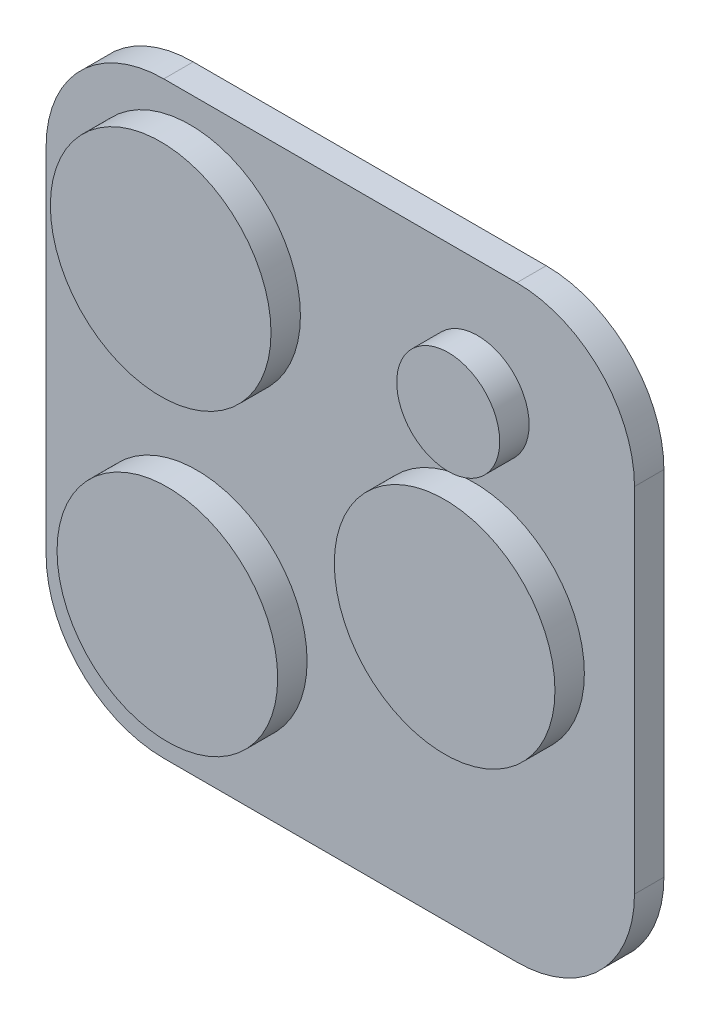
ISO-10303-21;
HEADER;
FILE_DESCRIPTION(('STEP AP214'),'2;1');
FILE_NAME('part.step','',(''),(''),'','','');
FILE_SCHEMA(('AUTOMOTIVE_DESIGN { 1 0 10303 214 1 1 1 1 }'));
ENDSEC;
DATA;
#1=APPLICATION_CONTEXT('core data for automotive mechanical design processes');
#2=APPLICATION_PROTOCOL_DEFINITION('international standard','automotive_design',2000,#1);
#3=PRODUCT_CONTEXT('',#1,'mechanical');
#4=PRODUCT('Part','Part','',(#3));
#5=PRODUCT_RELATED_PRODUCT_CATEGORY('part','',(#4));
#6=PRODUCT_DEFINITION_FORMATION('','',#4);
#7=PRODUCT_DEFINITION_CONTEXT('part definition',#1,'design');
#8=PRODUCT_DEFINITION('design','',#6,#7);
#9=PRODUCT_DEFINITION_SHAPE('','',#8);
#10=(LENGTH_UNIT() NAMED_UNIT(*) SI_UNIT(.MILLI.,.METRE.));
#11=(NAMED_UNIT(*) PLANE_ANGLE_UNIT() SI_UNIT($,.RADIAN.));
#12=(NAMED_UNIT(*) SI_UNIT($,.STERADIAN.) SOLID_ANGLE_UNIT());
#13=UNCERTAINTY_MEASURE_WITH_UNIT(LENGTH_MEASURE(1.E-05),#10,'distance_accuracy_value','');
#14=(GEOMETRIC_REPRESENTATION_CONTEXT(3) GLOBAL_UNCERTAINTY_ASSIGNED_CONTEXT((#13)) GLOBAL_UNIT_ASSIGNED_CONTEXT((#10,
#11,#12)) REPRESENTATION_CONTEXT('',''));
#15=CARTESIAN_POINT('',(0.,0.,0.));
#16=DIRECTION('',(0.,0.,1.));
#17=DIRECTION('',(1.,0.,0.));
#18=AXIS2_PLACEMENT_3D('',#15,#16,#17);
#19=CARTESIAN_POINT('',(-10.262996941896,-16.1590214067278,2.));
#20=DIRECTION('',(0.,0.,-1.));
#21=DIRECTION('',(-1.,0.,0.));
#22=AXIS2_PLACEMENT_3D('',#19,#20,#21);
#23=CYLINDRICAL_SURFACE('',#22,8.);
#24=CARTESIAN_POINT('',(-10.262996941896,-16.1590214067278,0.));
#25=DIRECTION('',(0.,0.,1.));
#26=DIRECTION('',(1.,0.,0.));
#27=AXIS2_PLACEMENT_3D('',#24,#25,#26);
#28=CIRCLE('',#27,8.);
#29=CARTESIAN_POINT('',(-10.2629969418961,-24.1590214067278,0.));
#30=VERTEX_POINT('',#29);
#31=CARTESIAN_POINT('',(-2.26299694189602,-16.1590214067278,0.));
#32=VERTEX_POINT('',#31);
#33=EDGE_CURVE('E135',#30,#32,#28,.T.);
#34=ORIENTED_EDGE('',*,*,#33,.T.);
#35=DIRECTION('',(0.,0.,-1.));
#36=VECTOR('',#35,1.);
#37=CARTESIAN_POINT('',(-2.26299694189602,-16.1590214067278,2.));
#38=LINE('',#37,#36);
#39=CARTESIAN_POINT('',(-2.26299694189602,-16.1590214067278,2.));
#40=VERTEX_POINT('',#39);
#41=EDGE_CURVE('E11',#40,#32,#38,.T.);
#42=ORIENTED_EDGE('',*,*,#41,.F.);
#43=CARTESIAN_POINT('',(-10.262996941896,-16.1590214067278,2.));
#44=DIRECTION('',(0.,0.,1.));
#45=DIRECTION('',(1.,0.,0.));
#46=AXIS2_PLACEMENT_3D('',#43,#44,#45);
#47=CIRCLE('',#46,8.);
#48=CARTESIAN_POINT('',(-10.2629969418961,-24.1590214067278,2.));
#49=VERTEX_POINT('',#48);
#50=EDGE_CURVE('E150',#49,#40,#47,.T.);
#51=ORIENTED_EDGE('',*,*,#50,.F.);
#52=DIRECTION('',(0.,0.,-1.));
#53=VECTOR('',#52,1.);
#54=CARTESIAN_POINT('',(-10.2629969418961,-24.1590214067278,2.));
#55=LINE('',#54,#53);
#56=EDGE_CURVE('E131',#49,#30,#55,.T.);
#57=ORIENTED_EDGE('',*,*,#56,.T.);
#58=EDGE_LOOP('',(#34,#42,#51,#57));
#59=FACE_BOUND('',#58,.T.);
#60=ADVANCED_FACE('F39',(#59),#23,.T.);
#61=CARTESIAN_POINT('',(-2.26299694189602,7.84097859327211,2.));
#62=DIRECTION('',(-1.,0.,0.));
#63=DIRECTION('',(0.,-1.,0.));
#64=AXIS2_PLACEMENT_3D('',#61,#62,#63);
#65=PLANE('',#64);
#66=DIRECTION('',(0.,1.,0.));
#67=VECTOR('',#66,1.);
#68=CARTESIAN_POINT('',(-2.26299694189602,7.84097859327211,0.));
#69=LINE('',#68,#67);
#70=CARTESIAN_POINT('',(-2.26299694189602,7.84097859327211,0.));
#71=VERTEX_POINT('',#70);
#72=EDGE_CURVE('E138',#32,#71,#69,.T.);
#73=ORIENTED_EDGE('',*,*,#72,.T.);
#74=DIRECTION('',(0.,0.,-1.));
#75=VECTOR('',#74,1.);
#76=CARTESIAN_POINT('',(-2.26299694189602,7.84097859327211,2.));
#77=LINE('',#76,#75);
#78=CARTESIAN_POINT('',(-2.26299694189602,7.84097859327211,2.));
#79=VERTEX_POINT('',#78);
#80=EDGE_CURVE('E47',#79,#71,#77,.T.);
#81=ORIENTED_EDGE('',*,*,#80,.F.);
#82=DIRECTION('',(0.,1.,0.));
#83=VECTOR('',#82,1.);
#84=CARTESIAN_POINT('',(-2.26299694189602,7.84097859327211,2.));
#85=LINE('',#84,#83);
#86=EDGE_CURVE('E98',#40,#79,#85,.T.);
#87=ORIENTED_EDGE('',*,*,#86,.F.);
#88=ORIENTED_EDGE('',*,*,#41,.T.);
#89=EDGE_LOOP('',(#73,#81,#87,#88));
#90=FACE_BOUND('',#89,.T.);
#91=ADVANCED_FACE('F234',(#90),#65,.F.);
#92=CARTESIAN_POINT('',(-10.262996941896,7.84097859327217,2.));
#93=DIRECTION('',(0.,0.,-1.));
#94=DIRECTION('',(-1.,0.,0.));
#95=AXIS2_PLACEMENT_3D('',#92,#93,#94);
#96=CYLINDRICAL_SURFACE('',#95,8.);
#97=CARTESIAN_POINT('',(-10.262996941896,7.84097859327217,0.));
#98=DIRECTION('',(0.,0.,1.));
#99=DIRECTION('',(-1.,0.,0.));
#100=AXIS2_PLACEMENT_3D('',#97,#98,#99);
#101=CIRCLE('',#100,8.);
#102=CARTESIAN_POINT('',(-10.2629969418961,15.8409785932722,0.));
#103=VERTEX_POINT('',#102);
#104=EDGE_CURVE('E141',#71,#103,#101,.T.);
#105=ORIENTED_EDGE('',*,*,#104,.T.);
#106=DIRECTION('',(0.,0.,-1.));
#107=VECTOR('',#106,1.);
#108=CARTESIAN_POINT('',(-10.2629969418961,15.8409785932722,2.));
#109=LINE('',#108,#107);
#110=CARTESIAN_POINT('',(-10.2629969418961,15.8409785932722,2.));
#111=VERTEX_POINT('',#110);
#112=EDGE_CURVE('E157',#111,#103,#109,.T.);
#113=ORIENTED_EDGE('',*,*,#112,.F.);
#114=CARTESIAN_POINT('',(-10.262996941896,7.84097859327217,2.));
#115=DIRECTION('',(0.,0.,1.));
#116=DIRECTION('',(-1.,0.,0.));
#117=AXIS2_PLACEMENT_3D('',#114,#115,#116);
#118=CIRCLE('',#117,8.);
#119=EDGE_CURVE('E165',#79,#111,#118,.T.);
#120=ORIENTED_EDGE('',*,*,#119,.F.);
#121=ORIENTED_EDGE('',*,*,#80,.T.);
#122=EDGE_LOOP('',(#105,#113,#120,#121));
#123=FACE_BOUND('',#122,.T.);
#124=ADVANCED_FACE('F163',(#123),#96,.T.);
#125=CARTESIAN_POINT('',(-34.262996941896,15.8409785932722,2.));
#126=DIRECTION('',(0.,-1.,0.));
#127=DIRECTION('',(0.,0.,-1.));
#128=AXIS2_PLACEMENT_3D('',#125,#126,#127);
#129=PLANE('',#128);
#130=DIRECTION('',(-1.,0.,0.));
#131=VECTOR('',#130,1.);
#132=CARTESIAN_POINT('',(-34.262996941896,15.8409785932722,0.));
#133=LINE('',#132,#131);
#134=CARTESIAN_POINT('',(-34.262996941896,15.8409785932722,0.));
#135=VERTEX_POINT('',#134);
#136=EDGE_CURVE('E143',#103,#135,#133,.T.);
#137=ORIENTED_EDGE('',*,*,#136,.T.);
#138=DIRECTION('',(0.,0.,-1.));
#139=VECTOR('',#138,1.);
#140=CARTESIAN_POINT('',(-34.262996941896,15.8409785932722,2.));
#141=LINE('',#140,#139);
#142=CARTESIAN_POINT('',(-34.262996941896,15.8409785932722,2.));
#143=VERTEX_POINT('',#142);
#144=EDGE_CURVE('E154',#143,#135,#141,.T.);
#145=ORIENTED_EDGE('',*,*,#144,.F.);
#146=DIRECTION('',(-1.,0.,0.));
#147=VECTOR('',#146,1.);
#148=CARTESIAN_POINT('',(-34.262996941896,15.8409785932722,2.));
#149=LINE('',#148,#147);
#150=EDGE_CURVE('E177',#111,#143,#149,.T.);
#151=ORIENTED_EDGE('',*,*,#150,.F.);
#152=ORIENTED_EDGE('',*,*,#112,.T.);
#153=EDGE_LOOP('',(#137,#145,#151,#152));
#154=FACE_BOUND('',#153,.T.);
#155=ADVANCED_FACE('F173',(#154),#129,.F.);
#156=CARTESIAN_POINT('',(-34.262996941896,7.84097859327217,2.));
#157=DIRECTION('',(0.,0.,-1.));
#158=DIRECTION('',(-1.,0.,0.));
#159=AXIS2_PLACEMENT_3D('',#156,#157,#158);
#160=CYLINDRICAL_SURFACE('',#159,8.);
#161=CARTESIAN_POINT('',(-34.262996941896,7.84097859327217,0.));
#162=DIRECTION('',(0.,0.,1.));
#163=DIRECTION('',(-1.,0.,0.));
#164=AXIS2_PLACEMENT_3D('',#161,#162,#163);
#165=CIRCLE('',#164,8.);
#166=CARTESIAN_POINT('',(-42.262996941896,7.84097859327211,0.));
#167=VERTEX_POINT('',#166);
#168=EDGE_CURVE('E145',#135,#167,#165,.T.);
#169=ORIENTED_EDGE('',*,*,#168,.T.);
#170=DIRECTION('',(0.,0.,-1.));
#171=VECTOR('',#170,1.);
#172=CARTESIAN_POINT('',(-42.262996941896,7.84097859327211,2.));
#173=LINE('',#172,#171);
#174=CARTESIAN_POINT('',(-42.262996941896,7.84097859327211,2.));
#175=VERTEX_POINT('',#174);
#176=EDGE_CURVE('E126',#175,#167,#173,.T.);
#177=ORIENTED_EDGE('',*,*,#176,.F.);
#178=CARTESIAN_POINT('',(-34.262996941896,7.84097859327217,2.));
#179=DIRECTION('',(0.,0.,1.));
#180=DIRECTION('',(-1.,0.,0.));
#181=AXIS2_PLACEMENT_3D('',#178,#179,#180);
#182=CIRCLE('',#181,8.);
#183=EDGE_CURVE('E117',#143,#175,#182,.T.);
#184=ORIENTED_EDGE('',*,*,#183,.F.);
#185=ORIENTED_EDGE('',*,*,#144,.T.);
#186=EDGE_LOOP('',(#169,#177,#184,#185));
#187=FACE_BOUND('',#186,.T.);
#188=ADVANCED_FACE('F176',(#187),#160,.T.);
#189=CARTESIAN_POINT('',(-42.262996941896,7.84097859327211,2.));
#190=DIRECTION('',(1.,0.,0.));
#191=DIRECTION('',(0.,0.,-1.));
#192=AXIS2_PLACEMENT_3D('',#189,#190,#191);
#193=PLANE('',#192);
#194=DIRECTION('',(0.,-1.,0.));
#195=VECTOR('',#194,1.);
#196=CARTESIAN_POINT('',(-42.262996941896,7.84097859327211,0.));
#197=LINE('',#196,#195);
#198=CARTESIAN_POINT('',(-42.262996941896,-16.1590214067278,0.));
#199=VERTEX_POINT('',#198);
#200=EDGE_CURVE('E125',#167,#199,#197,.T.);
#201=ORIENTED_EDGE('',*,*,#200,.T.);
#202=DIRECTION('',(0.,0.,-1.));
#203=VECTOR('',#202,1.);
#204=CARTESIAN_POINT('',(-42.262996941896,-16.1590214067278,2.));
#205=LINE('',#204,#203);
#206=CARTESIAN_POINT('',(-42.262996941896,-16.1590214067278,2.));
#207=VERTEX_POINT('',#206);
#208=EDGE_CURVE('E122',#207,#199,#205,.T.);
#209=ORIENTED_EDGE('',*,*,#208,.F.);
#210=DIRECTION('',(0.,-1.,0.));
#211=VECTOR('',#210,1.);
#212=CARTESIAN_POINT('',(-42.262996941896,7.84097859327211,2.));
#213=LINE('',#212,#211);
#214=EDGE_CURVE('E111',#175,#207,#213,.T.);
#215=ORIENTED_EDGE('',*,*,#214,.F.);
#216=ORIENTED_EDGE('',*,*,#176,.T.);
#217=EDGE_LOOP('',(#201,#209,#215,#216));
#218=FACE_BOUND('',#217,.T.);
#219=ADVANCED_FACE('F123',(#218),#193,.F.);
#220=CARTESIAN_POINT('',(-34.262996941896,-16.1590214067278,2.));
#221=DIRECTION('',(0.,0.,-1.));
#222=DIRECTION('',(-1.,0.,0.));
#223=AXIS2_PLACEMENT_3D('',#220,#221,#222);
#224=CYLINDRICAL_SURFACE('',#223,8.);
#225=CARTESIAN_POINT('',(-34.262996941896,-16.1590214067278,0.));
#226=DIRECTION('',(0.,0.,1.));
#227=DIRECTION('',(-1.,0.,0.));
#228=AXIS2_PLACEMENT_3D('',#225,#226,#227);
#229=CIRCLE('',#228,8.);
#230=CARTESIAN_POINT('',(-34.262996941896,-24.1590214067278,0.));
#231=VERTEX_POINT('',#230);
#232=EDGE_CURVE('E84',#199,#231,#229,.T.);
#233=ORIENTED_EDGE('',*,*,#232,.T.);
#234=DIRECTION('',(0.,0.,-1.));
#235=VECTOR('',#234,1.);
#236=CARTESIAN_POINT('',(-34.262996941896,-24.1590214067278,2.));
#237=LINE('',#236,#235);
#238=CARTESIAN_POINT('',(-34.262996941896,-24.1590214067278,2.));
#239=VERTEX_POINT('',#238);
#240=EDGE_CURVE('E127',#239,#231,#237,.T.);
#241=ORIENTED_EDGE('',*,*,#240,.F.);
#242=CARTESIAN_POINT('',(-34.262996941896,-16.1590214067278,2.));
#243=DIRECTION('',(0.,0.,1.));
#244=DIRECTION('',(-1.,0.,0.));
#245=AXIS2_PLACEMENT_3D('',#242,#243,#244);
#246=CIRCLE('',#245,8.);
#247=EDGE_CURVE('E115',#207,#239,#246,.T.);
#248=ORIENTED_EDGE('',*,*,#247,.F.);
#249=ORIENTED_EDGE('',*,*,#208,.T.);
#250=EDGE_LOOP('',(#233,#241,#248,#249));
#251=FACE_BOUND('',#250,.T.);
#252=ADVANCED_FACE('F129',(#251),#224,.T.);
#253=CARTESIAN_POINT('',(-34.262996941896,-24.1590214067278,2.));
#254=DIRECTION('',(0.,1.,0.));
#255=DIRECTION('',(0.,0.,1.));
#256=AXIS2_PLACEMENT_3D('',#253,#254,#255);
#257=PLANE('',#256);
#258=DIRECTION('',(1.,0.,0.));
#259=VECTOR('',#258,1.);
#260=CARTESIAN_POINT('',(-34.262996941896,-24.1590214067278,0.));
#261=LINE('',#260,#259);
#262=EDGE_CURVE('E90',#231,#30,#261,.T.);
#263=ORIENTED_EDGE('',*,*,#262,.T.);
#264=ORIENTED_EDGE('',*,*,#56,.F.);
#265=DIRECTION('',(1.,0.,0.));
#266=VECTOR('',#265,1.);
#267=CARTESIAN_POINT('',(-34.262996941896,-24.1590214067278,2.));
#268=LINE('',#267,#266);
#269=EDGE_CURVE('E55',#239,#49,#268,.T.);
#270=ORIENTED_EDGE('',*,*,#269,.F.);
#271=ORIENTED_EDGE('',*,*,#240,.T.);
#272=EDGE_LOOP('',(#263,#264,#270,#271));
#273=FACE_BOUND('',#272,.T.);
#274=ADVANCED_FACE('F211',(#273),#257,.F.);
#275=CARTESIAN_POINT('',(-10.262996941896,-16.1590214067278,2.));
#276=DIRECTION('',(0.,0.,1.));
#277=DIRECTION('',(1.,0.,0.));
#278=AXIS2_PLACEMENT_3D('',#275,#276,#277);
#279=PLANE('',#278);
#280=CARTESIAN_POINT('',(-12.9257864706033,7.90081492161476,2.));
#281=DIRECTION('',(0.,0.,1.));
#282=DIRECTION('',(1.,0.,0.));
#283=AXIS2_PLACEMENT_3D('',#280,#281,#282);
#284=CIRCLE('',#283,3.5);
#285=CARTESIAN_POINT('',(-9.42578647060328,7.90081492161476,2.));
#286=VERTEX_POINT('',#285);
#287=EDGE_CURVE('E198',#286,#286,#284,.T.);
#288=ORIENTED_EDGE('',*,*,#287,.F.);
#289=EDGE_LOOP('',(#288));
#290=FACE_BOUND('',#289,.T.);
#291=CARTESIAN_POINT('',(-13.1701246885437,-4.87458333069606,2.));
#292=DIRECTION('',(0.,0.,1.));
#293=DIRECTION('',(1.,0.,0.));
#294=AXIS2_PLACEMENT_3D('',#291,#292,#293);
#295=CIRCLE('',#294,7.5);
#296=CARTESIAN_POINT('',(-5.67012468854365,-4.87458333069606,2.));
#297=VERTEX_POINT('',#296);
#298=EDGE_CURVE('E192',#297,#297,#295,.T.);
#299=ORIENTED_EDGE('',*,*,#298,.F.);
#300=EDGE_LOOP('',(#299));
#301=FACE_BOUND('',#300,.T.);
#302=CARTESIAN_POINT('',(-32.019072929658,-13.5660427974321,2.));
#303=DIRECTION('',(0.,0.,1.));
#304=DIRECTION('',(1.,0.,0.));
#305=AXIS2_PLACEMENT_3D('',#302,#303,#304);
#306=CIRCLE('',#305,7.5);
#307=CARTESIAN_POINT('',(-24.519072929658,-13.5660427974321,2.));
#308=VERTEX_POINT('',#307);
#309=EDGE_CURVE('E186',#308,#308,#306,.T.);
#310=ORIENTED_EDGE('',*,*,#309,.F.);
#311=EDGE_LOOP('',(#310));
#312=FACE_BOUND('',#311,.T.);
#313=CARTESIAN_POINT('',(-32.4728439058329,6.53950199308984,2.));
#314=DIRECTION('',(0.,0.,1.));
#315=DIRECTION('',(1.,0.,0.));
#316=AXIS2_PLACEMENT_3D('',#313,#314,#315);
#317=CIRCLE('',#316,7.5);
#318=CARTESIAN_POINT('',(-24.9728439058329,6.53950199308984,2.));
#319=VERTEX_POINT('',#318);
#320=EDGE_CURVE('E183',#319,#319,#317,.T.);
#321=ORIENTED_EDGE('',*,*,#320,.F.);
#322=EDGE_LOOP('',(#321));
#323=FACE_BOUND('',#322,.T.);
#324=ORIENTED_EDGE('',*,*,#50,.T.);
#325=ORIENTED_EDGE('',*,*,#86,.T.);
#326=ORIENTED_EDGE('',*,*,#119,.T.);
#327=ORIENTED_EDGE('',*,*,#150,.T.);
#328=ORIENTED_EDGE('',*,*,#183,.T.);
#329=ORIENTED_EDGE('',*,*,#214,.T.);
#330=ORIENTED_EDGE('',*,*,#247,.T.);
#331=ORIENTED_EDGE('',*,*,#269,.T.);
#332=EDGE_LOOP('',(#324,#325,#326,#327,#328,#329,#330,#331));
#333=FACE_BOUND('',#332,.T.);
#334=ADVANCED_FACE('F113',(#290,#301,#312,#323,#333),#279,.T.);
#335=CARTESIAN_POINT('',(-10.262996941896,-16.1590214067278,0.));
#336=DIRECTION('',(0.,0.,1.));
#337=DIRECTION('',(1.,0.,0.));
#338=AXIS2_PLACEMENT_3D('',#335,#336,#337);
#339=PLANE('',#338);
#340=ORIENTED_EDGE('',*,*,#33,.F.);
#341=ORIENTED_EDGE('',*,*,#262,.F.);
#342=ORIENTED_EDGE('',*,*,#232,.F.);
#343=ORIENTED_EDGE('',*,*,#200,.F.);
#344=ORIENTED_EDGE('',*,*,#168,.F.);
#345=ORIENTED_EDGE('',*,*,#136,.F.);
#346=ORIENTED_EDGE('',*,*,#104,.F.);
#347=ORIENTED_EDGE('',*,*,#72,.F.);
#348=EDGE_LOOP('',(#340,#341,#342,#343,#344,#345,#346,#347));
#349=FACE_BOUND('',#348,.T.);
#350=ADVANCED_FACE('F169',(#349),#339,.F.);
#351=CARTESIAN_POINT('',(-32.4728439058329,6.53950199308984,4.));
#352=DIRECTION('',(0.,0.,-1.));
#353=DIRECTION('',(-1.,0.,0.));
#354=AXIS2_PLACEMENT_3D('',#351,#352,#353);
#355=CYLINDRICAL_SURFACE('',#354,7.5);
#356=CARTESIAN_POINT('',(-32.4728439058329,6.53950199308984,4.));
#357=DIRECTION('',(0.,0.,1.));
#358=DIRECTION('',(1.,0.,0.));
#359=AXIS2_PLACEMENT_3D('',#356,#357,#358);
#360=CIRCLE('',#359,7.5);
#361=CARTESIAN_POINT('',(-24.9728439058329,6.53950199308984,4.));
#362=VERTEX_POINT('',#361);
#363=EDGE_CURVE('E139',#362,#362,#360,.T.);
#364=ORIENTED_EDGE('',*,*,#363,.F.);
#365=EDGE_LOOP('',(#364));
#366=FACE_BOUND('',#365,.T.);
#367=ORIENTED_EDGE('',*,*,#320,.T.);
#368=EDGE_LOOP('',(#367));
#369=FACE_BOUND('',#368,.T.);
#370=ADVANCED_FACE('F219',(#366,#369),#355,.T.);
#371=CARTESIAN_POINT('',(-32.4728439058329,6.53950199308984,4.));
#372=DIRECTION('',(0.,0.,1.));
#373=DIRECTION('',(1.,0.,0.));
#374=AXIS2_PLACEMENT_3D('',#371,#372,#373);
#375=PLANE('',#374);
#376=ORIENTED_EDGE('',*,*,#363,.T.);
#377=EDGE_LOOP('',(#376));
#378=FACE_BOUND('',#377,.T.);
#379=ADVANCED_FACE('F221',(#378),#375,.T.);
#380=CARTESIAN_POINT('',(-32.019072929658,-13.5660427974321,4.));
#381=DIRECTION('',(0.,0.,-1.));
#382=DIRECTION('',(-1.,0.,0.));
#383=AXIS2_PLACEMENT_3D('',#380,#381,#382);
#384=CYLINDRICAL_SURFACE('',#383,7.5);
#385=CARTESIAN_POINT('',(-32.019072929658,-13.5660427974321,4.));
#386=DIRECTION('',(0.,0.,1.));
#387=DIRECTION('',(1.,0.,0.));
#388=AXIS2_PLACEMENT_3D('',#385,#386,#387);
#389=CIRCLE('',#388,7.5);
#390=CARTESIAN_POINT('',(-24.519072929658,-13.5660427974321,4.));
#391=VERTEX_POINT('',#390);
#392=EDGE_CURVE('E189',#391,#391,#389,.T.);
#393=ORIENTED_EDGE('',*,*,#392,.F.);
#394=EDGE_LOOP('',(#393));
#395=FACE_BOUND('',#394,.T.);
#396=ORIENTED_EDGE('',*,*,#309,.T.);
#397=EDGE_LOOP('',(#396));
#398=FACE_BOUND('',#397,.T.);
#399=ADVANCED_FACE('F228',(#395,#398),#384,.T.);
#400=CARTESIAN_POINT('',(-32.019072929658,-13.5660427974321,4.));
#401=DIRECTION('',(0.,0.,1.));
#402=DIRECTION('',(1.,0.,0.));
#403=AXIS2_PLACEMENT_3D('',#400,#401,#402);
#404=PLANE('',#403);
#405=ORIENTED_EDGE('',*,*,#392,.T.);
#406=EDGE_LOOP('',(#405));
#407=FACE_BOUND('',#406,.T.);
#408=ADVANCED_FACE('F316',(#407),#404,.T.);
#409=CARTESIAN_POINT('',(-13.1701246885437,-4.87458333069606,4.));
#410=DIRECTION('',(0.,0.,-1.));
#411=DIRECTION('',(-1.,0.,0.));
#412=AXIS2_PLACEMENT_3D('',#409,#410,#411);
#413=CYLINDRICAL_SURFACE('',#412,7.5);
#414=CARTESIAN_POINT('',(-13.1701246885437,-4.87458333069606,4.));
#415=DIRECTION('',(0.,0.,1.));
#416=DIRECTION('',(1.,0.,0.));
#417=AXIS2_PLACEMENT_3D('',#414,#415,#416);
#418=CIRCLE('',#417,7.5);
#419=CARTESIAN_POINT('',(-5.67012468854365,-4.87458333069606,4.));
#420=VERTEX_POINT('',#419);
#421=EDGE_CURVE('E195',#420,#420,#418,.T.);
#422=ORIENTED_EDGE('',*,*,#421,.F.);
#423=EDGE_LOOP('',(#422));
#424=FACE_BOUND('',#423,.T.);
#425=ORIENTED_EDGE('',*,*,#298,.T.);
#426=EDGE_LOOP('',(#425));
#427=FACE_BOUND('',#426,.T.);
#428=ADVANCED_FACE('F327',(#424,#427),#413,.T.);
#429=CARTESIAN_POINT('',(-13.1701246885437,-4.87458333069606,4.));
#430=DIRECTION('',(0.,0.,1.));
#431=DIRECTION('',(1.,0.,0.));
#432=AXIS2_PLACEMENT_3D('',#429,#430,#431);
#433=PLANE('',#432);
#434=ORIENTED_EDGE('',*,*,#421,.T.);
#435=EDGE_LOOP('',(#434));
#436=FACE_BOUND('',#435,.T.);
#437=ADVANCED_FACE('F338',(#436),#433,.T.);
#438=CARTESIAN_POINT('',(-12.9257864706033,7.90081492161476,4.));
#439=DIRECTION('',(0.,0.,-1.));
#440=DIRECTION('',(-1.,0.,0.));
#441=AXIS2_PLACEMENT_3D('',#438,#439,#440);
#442=CYLINDRICAL_SURFACE('',#441,3.5);
#443=CARTESIAN_POINT('',(-12.9257864706033,7.90081492161476,4.));
#444=DIRECTION('',(0.,0.,1.));
#445=DIRECTION('',(1.,0.,0.));
#446=AXIS2_PLACEMENT_3D('',#443,#444,#445);
#447=CIRCLE('',#446,3.5);
#448=CARTESIAN_POINT('',(-9.42578647060328,7.90081492161476,4.));
#449=VERTEX_POINT('',#448);
#450=EDGE_CURVE('E201',#449,#449,#447,.T.);
#451=ORIENTED_EDGE('',*,*,#450,.F.);
#452=EDGE_LOOP('',(#451));
#453=FACE_BOUND('',#452,.T.);
#454=ORIENTED_EDGE('',*,*,#287,.T.);
#455=EDGE_LOOP('',(#454));
#456=FACE_BOUND('',#455,.T.);
#457=ADVANCED_FACE('F207',(#453,#456),#442,.T.);
#458=CARTESIAN_POINT('',(-12.9257864706033,7.90081492161476,4.));
#459=DIRECTION('',(0.,0.,1.));
#460=DIRECTION('',(1.,0.,0.));
#461=AXIS2_PLACEMENT_3D('',#458,#459,#460);
#462=PLANE('',#461);
#463=ORIENTED_EDGE('',*,*,#450,.T.);
#464=EDGE_LOOP('',(#463));
#465=FACE_BOUND('',#464,.T.);
#466=ADVANCED_FACE('F359',(#465),#462,.T.);
#467=CLOSED_SHELL('',(#60,#91,#124,#155,#188,#219,#252,#274,#334,#350,#370,#379,#399,#408,#428,
#437,#457,#466));
#468=MANIFOLD_SOLID_BREP('B2',#467);
#469=ADVANCED_BREP_SHAPE_REPRESENTATION('',(#18,#468),#14);
#470=SHAPE_DEFINITION_REPRESENTATION(#9,#469);
ENDSEC;
END-ISO-10303-21;
